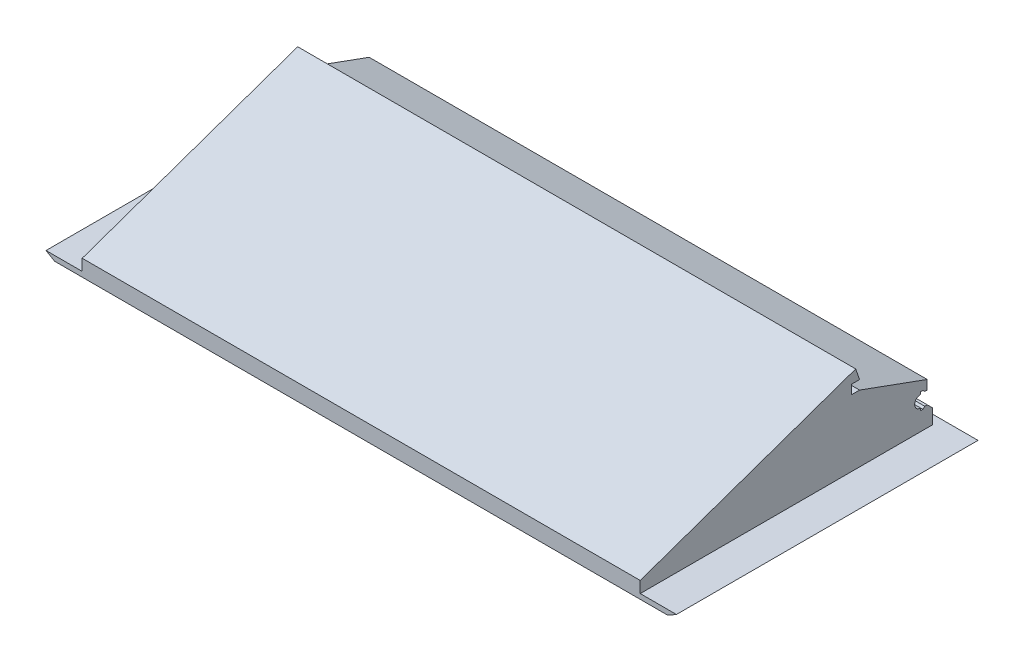
ISO-10303-21;
HEADER;
FILE_DESCRIPTION(('STEP AP214'),'2;1');
FILE_NAME('part.step','',(''),(''),'','','');
FILE_SCHEMA(('AUTOMOTIVE_DESIGN { 1 0 10303 214 1 1 1 1 }'));
ENDSEC;
DATA;
#1=APPLICATION_CONTEXT('core data for automotive mechanical design processes');
#2=APPLICATION_PROTOCOL_DEFINITION('international standard','automotive_design',2000,#1);
#3=PRODUCT_CONTEXT('',#1,'mechanical');
#4=PRODUCT('Part','Part','',(#3));
#5=PRODUCT_RELATED_PRODUCT_CATEGORY('part','',(#4));
#6=PRODUCT_DEFINITION_FORMATION('','',#4);
#7=PRODUCT_DEFINITION_CONTEXT('part definition',#1,'design');
#8=PRODUCT_DEFINITION('design','',#6,#7);
#9=PRODUCT_DEFINITION_SHAPE('','',#8);
#10=(LENGTH_UNIT() NAMED_UNIT(*) SI_UNIT(.MILLI.,.METRE.));
#11=(NAMED_UNIT(*) PLANE_ANGLE_UNIT() SI_UNIT($,.RADIAN.));
#12=(NAMED_UNIT(*) SI_UNIT($,.STERADIAN.) SOLID_ANGLE_UNIT());
#13=UNCERTAINTY_MEASURE_WITH_UNIT(LENGTH_MEASURE(1.E-05),#10,'distance_accuracy_value','');
#14=(GEOMETRIC_REPRESENTATION_CONTEXT(3) GLOBAL_UNCERTAINTY_ASSIGNED_CONTEXT((#13)) GLOBAL_UNIT_ASSIGNED_CONTEXT((#10,
#11,#12)) REPRESENTATION_CONTEXT('',''));
#15=CARTESIAN_POINT('',(0.,0.,0.));
#16=DIRECTION('',(0.,0.,1.));
#17=DIRECTION('',(1.,0.,0.));
#18=AXIS2_PLACEMENT_3D('',#15,#16,#17);
#19=CARTESIAN_POINT('',(-687.5,2.50000000000008,1257.));
#20=DIRECTION('',(1.,0.,0.));
#21=DIRECTION('',(0.,0.,1.));
#22=AXIS2_PLACEMENT_3D('',#19,#20,#21);
#23=PLANE('',#22);
#24=DIRECTION('',(0.,-1.,0.));
#25=VECTOR('',#24,1.);
#26=CARTESIAN_POINT('',(-687.5,-30.5,1872.5));
#27=LINE('',#26,#25);
#28=CARTESIAN_POINT('',(-687.5,-30.5,1872.5));
#29=VERTEX_POINT('',#28);
#30=CARTESIAN_POINT('',(-687.5,-55.5,1872.5));
#31=VERTEX_POINT('',#30);
#32=EDGE_CURVE('E267',#29,#31,#27,.T.);
#33=ORIENTED_EDGE('',*,*,#32,.F.);
#34=DIRECTION('',(0.,-0.330436486116604,0.943828230475711));
#35=VECTOR('',#34,1.);
#36=CARTESIAN_POINT('',(-687.5,135.1049797885,1399.4812457193));
#37=LINE('',#36,#35);
#38=CARTESIAN_POINT('',(-687.5,135.1049797885,1399.4812457193));
#39=VERTEX_POINT('',#38);
#40=EDGE_CURVE('E36',#39,#29,#37,.T.);
#41=ORIENTED_EDGE('',*,*,#40,.F.);
#42=DIRECTION('',(0.,0.944844352116931,0.32751969448071));
#43=VECTOR('',#42,1.);
#44=CARTESIAN_POINT('',(-687.5,110.6378797885,1391.));
#45=LINE('',#44,#43);
#46=CARTESIAN_POINT('',(-687.5,110.6378797885,1391.));
#47=VERTEX_POINT('',#46);
#48=EDGE_CURVE('E236',#47,#39,#45,.T.);
#49=ORIENTED_EDGE('',*,*,#48,.F.);
#50=DIRECTION('',(0.,0.,-1.));
#51=VECTOR('',#50,1.);
#52=CARTESIAN_POINT('',(-687.5,110.6378797885,1409.));
#53=LINE('',#52,#51);
#54=CARTESIAN_POINT('',(-687.5,110.6378797885,1409.));
#55=VERTEX_POINT('',#54);
#56=EDGE_CURVE('E237',#55,#47,#53,.T.);
#57=ORIENTED_EDGE('',*,*,#56,.F.);
#58=DIRECTION('',(0.,1.,0.));
#59=VECTOR('',#58,1.);
#60=CARTESIAN_POINT('',(-687.5,90.6378797885301,1409.));
#61=LINE('',#60,#59);
#62=CARTESIAN_POINT('',(-687.5,90.6378797885301,1409.));
#63=VERTEX_POINT('',#62);
#64=EDGE_CURVE('E183',#63,#55,#61,.T.);
#65=ORIENTED_EDGE('',*,*,#64,.F.);
#66=DIRECTION('',(0.,0.,1.));
#67=VECTOR('',#66,1.);
#68=CARTESIAN_POINT('',(-687.5,90.6378797885301,1391.));
#69=LINE('',#68,#67);
#70=CARTESIAN_POINT('',(-687.5,90.6378797885301,1391.));
#71=VERTEX_POINT('',#70);
#72=EDGE_CURVE('E181',#71,#63,#69,.T.);
#73=ORIENTED_EDGE('',*,*,#72,.F.);
#74=DIRECTION('',(0.,0.342020143325699,0.939692620785897));
#75=VECTOR('',#74,1.);
#76=CARTESIAN_POINT('',(-687.5,36.5883,1242.5));
#77=LINE('',#76,#75);
#78=CARTESIAN_POINT('',(-687.5,36.5883,1242.5));
#79=VERTEX_POINT('',#78);
#80=EDGE_CURVE('E212',#79,#71,#77,.T.);
#81=ORIENTED_EDGE('',*,*,#80,.F.);
#82=DIRECTION('',(0.,1.,0.));
#83=VECTOR('',#82,1.);
#84=CARTESIAN_POINT('',(-687.5,16.5,1242.5));
#85=LINE('',#84,#83);
#86=CARTESIAN_POINT('',(-687.5,16.5,1242.5));
#87=VERTEX_POINT('',#86);
#88=EDGE_CURVE('E213',#87,#79,#85,.T.);
#89=ORIENTED_EDGE('',*,*,#88,.F.);
#90=DIRECTION('',(0.,0.,-1.));
#91=VECTOR('',#90,1.);
#92=CARTESIAN_POINT('',(-687.5,16.5,1248.));
#93=LINE('',#92,#91);
#94=CARTESIAN_POINT('',(-687.5,16.5,1248.));
#95=VERTEX_POINT('',#94);
#96=EDGE_CURVE('E21',#95,#87,#93,.T.);
#97=ORIENTED_EDGE('',*,*,#96,.F.);
#98=DIRECTION('',(0.,-0.707106781186498,-0.707106781186597));
#99=VECTOR('',#98,1.);
#100=CARTESIAN_POINT('',(-687.5,20.5,1252.));
#101=LINE('',#100,#99);
#102=CARTESIAN_POINT('',(-687.5,20.5,1252.));
#103=VERTEX_POINT('',#102);
#104=EDGE_CURVE('E257',#103,#95,#101,.T.);
#105=ORIENTED_EDGE('',*,*,#104,.F.);
#106=DIRECTION('',(0.,0.,-1.));
#107=VECTOR('',#106,1.);
#108=CARTESIAN_POINT('',(-687.5,20.5,1257.));
#109=LINE('',#108,#107);
#110=CARTESIAN_POINT('',(-687.5,20.5,1257.));
#111=VERTEX_POINT('',#110);
#112=EDGE_CURVE('E202',#111,#103,#109,.T.);
#113=ORIENTED_EDGE('',*,*,#112,.F.);
#114=DIRECTION('',(0.,1.,0.));
#115=VECTOR('',#114,1.);
#116=CARTESIAN_POINT('',(-687.5,15.5,1257.));
#117=LINE('',#116,#115);
#118=CARTESIAN_POINT('',(-687.5,15.5,1257.));
#119=VERTEX_POINT('',#118);
#120=EDGE_CURVE('E203',#119,#111,#117,.T.);
#121=ORIENTED_EDGE('',*,*,#120,.F.);
#122=CARTESIAN_POINT('',(-687.5,2.50000000000008,1257.));
#123=DIRECTION('',(-1.,0.,0.));
#124=DIRECTION('',(0.,-1.,0.));
#125=AXIS2_PLACEMENT_3D('',#122,#123,#124);
#126=CIRCLE('',#125,13.);
#127=CARTESIAN_POINT('',(-687.5,-10.5,1257.));
#128=VERTEX_POINT('',#127);
#129=EDGE_CURVE('E337',#128,#119,#126,.T.);
#130=ORIENTED_EDGE('',*,*,#129,.F.);
#131=DIRECTION('',(0.,1.,0.));
#132=VECTOR('',#131,1.);
#133=CARTESIAN_POINT('',(-687.5,-15.5,1257.));
#134=LINE('',#133,#132);
#135=CARTESIAN_POINT('',(-687.5,-15.5,1257.));
#136=VERTEX_POINT('',#135);
#137=EDGE_CURVE('E246',#136,#128,#134,.T.);
#138=ORIENTED_EDGE('',*,*,#137,.F.);
#139=DIRECTION('',(0.,0.,1.));
#140=VECTOR('',#139,1.);
#141=CARTESIAN_POINT('',(-687.5,-15.5,1252.));
#142=LINE('',#141,#140);
#143=CARTESIAN_POINT('',(-687.5,-15.5,1252.));
#144=VERTEX_POINT('',#143);
#145=EDGE_CURVE('E207',#144,#136,#142,.T.);
#146=ORIENTED_EDGE('',*,*,#145,.F.);
#147=DIRECTION('',(0.,-0.707106781186498,0.707106781186597));
#148=VECTOR('',#147,1.);
#149=CARTESIAN_POINT('',(-687.5,-11.5,1248.));
#150=LINE('',#149,#148);
#151=CARTESIAN_POINT('',(-687.5,-11.5,1248.));
#152=VERTEX_POINT('',#151);
#153=EDGE_CURVE('E208',#152,#144,#150,.T.);
#154=ORIENTED_EDGE('',*,*,#153,.F.);
#155=DIRECTION('',(0.,0.,1.));
#156=VECTOR('',#155,1.);
#157=CARTESIAN_POINT('',(-687.5,-11.5,1242.5));
#158=LINE('',#157,#156);
#159=CARTESIAN_POINT('',(-687.5,-11.5,1242.5));
#160=VERTEX_POINT('',#159);
#161=EDGE_CURVE('E285',#160,#152,#158,.T.);
#162=ORIENTED_EDGE('',*,*,#161,.F.);
#163=DIRECTION('',(0.,0.707106781186598,0.707106781186498));
#164=VECTOR('',#163,1.);
#165=CARTESIAN_POINT('',(-687.5,-23.,1231.));
#166=LINE('',#165,#164);
#167=CARTESIAN_POINT('',(-687.5,-23.,1231.));
#168=VERTEX_POINT('',#167);
#169=EDGE_CURVE('E214',#168,#160,#166,.T.);
#170=ORIENTED_EDGE('',*,*,#169,.F.);
#171=DIRECTION('',(0.,1.,0.));
#172=VECTOR('',#171,1.);
#173=CARTESIAN_POINT('',(-687.5,-55.5,1231.));
#174=LINE('',#173,#172);
#175=CARTESIAN_POINT('',(-687.5,-55.5,1231.));
#176=VERTEX_POINT('',#175);
#177=EDGE_CURVE('E217',#176,#168,#174,.T.);
#178=ORIENTED_EDGE('',*,*,#177,.F.);
#179=DIRECTION('',(0.,0.,-1.));
#180=VECTOR('',#179,1.);
#181=CARTESIAN_POINT('',(-687.5,-55.5,1872.5));
#182=LINE('',#181,#180);
#183=EDGE_CURVE('E263',#31,#176,#182,.T.);
#184=ORIENTED_EDGE('',*,*,#183,.F.);
#185=EDGE_LOOP('',(#33,#41,#49,#57,#65,#73,#81,#89,#97,#105,#113,#121,#130,#138,#146,#154,#162,
#170,#178,#184));
#186=FACE_BOUND('',#185,.T.);
#187=ADVANCED_FACE('F17',(#186),#23,.F.);
#188=CARTESIAN_POINT('',(617.,-55.5,1872.5));
#189=DIRECTION('',(0.,1.,0.));
#190=DIRECTION('',(0.,0.,-1.));
#191=AXIS2_PLACEMENT_3D('',#188,#189,#190);
#192=PLANE('',#191);
#193=DIRECTION('',(1.,0.,0.));
#194=VECTOR('',#193,1.);
#195=CARTESIAN_POINT('',(-687.5,-55.5,1231.));
#196=LINE('',#195,#194);
#197=CARTESIAN_POINT('',(537.5,-55.5,1231.));
#198=VERTEX_POINT('',#197);
#199=EDGE_CURVE('E11',#176,#198,#196,.T.);
#200=ORIENTED_EDGE('',*,*,#199,.T.);
#201=DIRECTION('',(0.,0.,-1.));
#202=VECTOR('',#201,1.);
#203=CARTESIAN_POINT('',(537.5,-55.5,1872.5));
#204=LINE('',#203,#202);
#205=CARTESIAN_POINT('',(537.5,-55.5,1872.5));
#206=VERTEX_POINT('',#205);
#207=EDGE_CURVE('E299',#206,#198,#204,.T.);
#208=ORIENTED_EDGE('',*,*,#207,.F.);
#209=DIRECTION('',(-1.,0.,0.));
#210=VECTOR('',#209,1.);
#211=CARTESIAN_POINT('',(617.,-55.5,1872.5));
#212=LINE('',#211,#210);
#213=CARTESIAN_POINT('',(617.,-55.5,1872.5));
#214=VERTEX_POINT('',#213);
#215=EDGE_CURVE('E232',#214,#206,#212,.T.);
#216=ORIENTED_EDGE('',*,*,#215,.F.);
#217=DIRECTION('',(0.,0.,-1.));
#218=VECTOR('',#217,1.);
#219=CARTESIAN_POINT('',(617.,-55.5,1872.5));
#220=LINE('',#219,#218);
#221=CARTESIAN_POINT('',(617.,-55.5,1210.5));
#222=VERTEX_POINT('',#221);
#223=EDGE_CURVE('E27',#214,#222,#220,.T.);
#224=ORIENTED_EDGE('',*,*,#223,.T.);
#225=DIRECTION('',(-1.,0.,0.));
#226=VECTOR('',#225,1.);
#227=CARTESIAN_POINT('',(617.,-55.5,1210.5));
#228=LINE('',#227,#226);
#229=CARTESIAN_POINT('',(-767.,-55.5,1210.5));
#230=VERTEX_POINT('',#229);
#231=EDGE_CURVE('E266',#222,#230,#228,.T.);
#232=ORIENTED_EDGE('',*,*,#231,.T.);
#233=DIRECTION('',(0.,0.,-1.));
#234=VECTOR('',#233,1.);
#235=CARTESIAN_POINT('',(-767.,-55.5,1872.5));
#236=LINE('',#235,#234);
#237=CARTESIAN_POINT('',(-767.,-55.5,1872.5));
#238=VERTEX_POINT('',#237);
#239=EDGE_CURVE('E295',#238,#230,#236,.T.);
#240=ORIENTED_EDGE('',*,*,#239,.F.);
#241=DIRECTION('',(-1.,0.,0.));
#242=VECTOR('',#241,1.);
#243=CARTESIAN_POINT('',(-687.5,-55.5,1872.5));
#244=LINE('',#243,#242);
#245=EDGE_CURVE('E277',#31,#238,#244,.T.);
#246=ORIENTED_EDGE('',*,*,#245,.F.);
#247=ORIENTED_EDGE('',*,*,#183,.T.);
#248=EDGE_LOOP('',(#200,#208,#216,#224,#232,#240,#246,#247));
#249=FACE_BOUND('',#248,.T.);
#250=ADVANCED_FACE('F19',(#249),#192,.T.);
#251=CARTESIAN_POINT('',(-687.5,-30.5,1872.5));
#252=DIRECTION('',(0.,0.,1.));
#253=DIRECTION('',(1.,0.,0.));
#254=AXIS2_PLACEMENT_3D('',#251,#252,#253);
#255=PLANE('',#254);
#256=DIRECTION('',(1.,0.,0.));
#257=VECTOR('',#256,1.);
#258=CARTESIAN_POINT('',(-687.5,-30.5,1872.5));
#259=LINE('',#258,#257);
#260=CARTESIAN_POINT('',(537.5,-30.5,1872.5));
#261=VERTEX_POINT('',#260);
#262=EDGE_CURVE('E192',#29,#261,#259,.T.);
#263=ORIENTED_EDGE('',*,*,#262,.F.);
#264=ORIENTED_EDGE('',*,*,#32,.T.);
#265=ORIENTED_EDGE('',*,*,#245,.T.);
#266=DIRECTION('',(0.866025403784429,-0.500000000000017,0.));
#267=VECTOR('',#266,1.);
#268=CARTESIAN_POINT('',(-767.,-55.5,1872.5));
#269=LINE('',#268,#267);
#270=CARTESIAN_POINT('',(-747.9474411167,-66.5,1872.5));
#271=VERTEX_POINT('',#270);
#272=EDGE_CURVE('E223',#238,#271,#269,.T.);
#273=ORIENTED_EDGE('',*,*,#272,.T.);
#274=DIRECTION('',(1.,0.,0.));
#275=VECTOR('',#274,1.);
#276=CARTESIAN_POINT('',(-747.9474411167,-66.5,1872.5));
#277=LINE('',#276,#275);
#278=CARTESIAN_POINT('',(597.9474411167,-66.5,1872.5));
#279=VERTEX_POINT('',#278);
#280=EDGE_CURVE('E220',#271,#279,#277,.T.);
#281=ORIENTED_EDGE('',*,*,#280,.T.);
#282=DIRECTION('',(0.866025403784429,0.500000000000017,0.));
#283=VECTOR('',#282,1.);
#284=CARTESIAN_POINT('',(597.9474411167,-66.5,1872.5));
#285=LINE('',#284,#283);
#286=EDGE_CURVE('E224',#279,#214,#285,.T.);
#287=ORIENTED_EDGE('',*,*,#286,.T.);
#288=ORIENTED_EDGE('',*,*,#215,.T.);
#289=DIRECTION('',(0.,-1.,0.));
#290=VECTOR('',#289,1.);
#291=CARTESIAN_POINT('',(537.5,-30.5,1872.5));
#292=LINE('',#291,#290);
#293=EDGE_CURVE('E301',#261,#206,#292,.T.);
#294=ORIENTED_EDGE('',*,*,#293,.F.);
#295=EDGE_LOOP('',(#263,#264,#265,#273,#281,#287,#288,#294));
#296=FACE_BOUND('',#295,.T.);
#297=ADVANCED_FACE('F401',(#296),#255,.T.);
#298=CARTESIAN_POINT('',(537.5,2.50000000000008,1257.));
#299=DIRECTION('',(1.,0.,0.));
#300=DIRECTION('',(0.,0.,1.));
#301=AXIS2_PLACEMENT_3D('',#298,#299,#300);
#302=PLANE('',#301);
#303=DIRECTION('',(0.,1.,0.));
#304=VECTOR('',#303,1.);
#305=CARTESIAN_POINT('',(537.5,-55.5,1231.));
#306=LINE('',#305,#304);
#307=CARTESIAN_POINT('',(537.5,-23.,1231.));
#308=VERTEX_POINT('',#307);
#309=EDGE_CURVE('E240',#198,#308,#306,.T.);
#310=ORIENTED_EDGE('',*,*,#309,.T.);
#311=DIRECTION('',(0.,0.707106781186598,0.707106781186498));
#312=VECTOR('',#311,1.);
#313=CARTESIAN_POINT('',(537.5,-23.,1231.));
#314=LINE('',#313,#312);
#315=CARTESIAN_POINT('',(537.5,-11.5,1242.5));
#316=VERTEX_POINT('',#315);
#317=EDGE_CURVE('E197',#308,#316,#314,.T.);
#318=ORIENTED_EDGE('',*,*,#317,.T.);
#319=DIRECTION('',(0.,0.,1.));
#320=VECTOR('',#319,1.);
#321=CARTESIAN_POINT('',(537.5,-11.5,1242.5));
#322=LINE('',#321,#320);
#323=CARTESIAN_POINT('',(537.5,-11.5,1248.));
#324=VERTEX_POINT('',#323);
#325=EDGE_CURVE('E194',#316,#324,#322,.T.);
#326=ORIENTED_EDGE('',*,*,#325,.T.);
#327=DIRECTION('',(0.,-0.707106781186498,0.707106781186597));
#328=VECTOR('',#327,1.);
#329=CARTESIAN_POINT('',(537.5,-11.5,1248.));
#330=LINE('',#329,#328);
#331=CARTESIAN_POINT('',(537.5,-15.5,1252.));
#332=VERTEX_POINT('',#331);
#333=EDGE_CURVE('E198',#324,#332,#330,.T.);
#334=ORIENTED_EDGE('',*,*,#333,.T.);
#335=DIRECTION('',(0.,0.,1.));
#336=VECTOR('',#335,1.);
#337=CARTESIAN_POINT('',(537.5,-15.5,1252.));
#338=LINE('',#337,#336);
#339=CARTESIAN_POINT('',(537.5,-15.5,1257.));
#340=VERTEX_POINT('',#339);
#341=EDGE_CURVE('E298',#332,#340,#338,.T.);
#342=ORIENTED_EDGE('',*,*,#341,.T.);
#343=DIRECTION('',(0.,1.,0.));
#344=VECTOR('',#343,1.);
#345=CARTESIAN_POINT('',(537.5,-15.5,1257.));
#346=LINE('',#345,#344);
#347=CARTESIAN_POINT('',(537.5,-10.5,1257.));
#348=VERTEX_POINT('',#347);
#349=EDGE_CURVE('E316',#340,#348,#346,.T.);
#350=ORIENTED_EDGE('',*,*,#349,.T.);
#351=CARTESIAN_POINT('',(537.5,2.50000000000008,1257.));
#352=DIRECTION('',(-1.,0.,0.));
#353=DIRECTION('',(0.,-1.,0.));
#354=AXIS2_PLACEMENT_3D('',#351,#352,#353);
#355=CIRCLE('',#354,13.);
#356=CARTESIAN_POINT('',(537.5,15.5,1257.));
#357=VERTEX_POINT('',#356);
#358=EDGE_CURVE('E252',#348,#357,#355,.T.);
#359=ORIENTED_EDGE('',*,*,#358,.T.);
#360=DIRECTION('',(0.,1.,0.));
#361=VECTOR('',#360,1.);
#362=CARTESIAN_POINT('',(537.5,15.5,1257.));
#363=LINE('',#362,#361);
#364=CARTESIAN_POINT('',(537.5,20.5,1257.));
#365=VERTEX_POINT('',#364);
#366=EDGE_CURVE('E249',#357,#365,#363,.T.);
#367=ORIENTED_EDGE('',*,*,#366,.T.);
#368=DIRECTION('',(0.,0.,-1.));
#369=VECTOR('',#368,1.);
#370=CARTESIAN_POINT('',(537.5,20.5,1257.));
#371=LINE('',#370,#369);
#372=CARTESIAN_POINT('',(537.5,20.5,1252.));
#373=VERTEX_POINT('',#372);
#374=EDGE_CURVE('E253',#365,#373,#371,.T.);
#375=ORIENTED_EDGE('',*,*,#374,.T.);
#376=DIRECTION('',(0.,-0.707106781186498,-0.707106781186597));
#377=VECTOR('',#376,1.);
#378=CARTESIAN_POINT('',(537.5,20.5,1252.));
#379=LINE('',#378,#377);
#380=CARTESIAN_POINT('',(537.5,16.5,1248.));
#381=VERTEX_POINT('',#380);
#382=EDGE_CURVE('E280',#373,#381,#379,.T.);
#383=ORIENTED_EDGE('',*,*,#382,.T.);
#384=DIRECTION('',(0.,0.,-1.));
#385=VECTOR('',#384,1.);
#386=CARTESIAN_POINT('',(537.5,16.5,1248.));
#387=LINE('',#386,#385);
#388=CARTESIAN_POINT('',(537.5,16.5,1242.5));
#389=VERTEX_POINT('',#388);
#390=EDGE_CURVE('E248',#381,#389,#387,.T.);
#391=ORIENTED_EDGE('',*,*,#390,.T.);
#392=DIRECTION('',(0.,1.,0.));
#393=VECTOR('',#392,1.);
#394=CARTESIAN_POINT('',(537.5,16.5,1242.5));
#395=LINE('',#394,#393);
#396=CARTESIAN_POINT('',(537.5,36.5883,1242.5));
#397=VERTEX_POINT('',#396);
#398=EDGE_CURVE('E219',#389,#397,#395,.T.);
#399=ORIENTED_EDGE('',*,*,#398,.T.);
#400=DIRECTION('',(0.,0.342020143325699,0.939692620785897));
#401=VECTOR('',#400,1.);
#402=CARTESIAN_POINT('',(537.5,36.5883,1242.5));
#403=LINE('',#402,#401);
#404=CARTESIAN_POINT('',(537.5,90.6378797885301,1391.));
#405=VERTEX_POINT('',#404);
#406=EDGE_CURVE('E174',#397,#405,#403,.T.);
#407=ORIENTED_EDGE('',*,*,#406,.T.);
#408=DIRECTION('',(0.,0.,1.));
#409=VECTOR('',#408,1.);
#410=CARTESIAN_POINT('',(537.5,90.6378797885301,1391.));
#411=LINE('',#410,#409);
#412=CARTESIAN_POINT('',(537.5,90.6378797885301,1409.));
#413=VERTEX_POINT('',#412);
#414=EDGE_CURVE('E167',#405,#413,#411,.T.);
#415=ORIENTED_EDGE('',*,*,#414,.T.);
#416=DIRECTION('',(0.,1.,0.));
#417=VECTOR('',#416,1.);
#418=CARTESIAN_POINT('',(537.5,90.6378797885301,1409.));
#419=LINE('',#418,#417);
#420=CARTESIAN_POINT('',(537.5,110.6378797885,1409.));
#421=VERTEX_POINT('',#420);
#422=EDGE_CURVE('E157',#413,#421,#419,.T.);
#423=ORIENTED_EDGE('',*,*,#422,.T.);
#424=DIRECTION('',(0.,0.,-1.));
#425=VECTOR('',#424,1.);
#426=CARTESIAN_POINT('',(537.5,110.6378797885,1409.));
#427=LINE('',#426,#425);
#428=CARTESIAN_POINT('',(537.5,110.6378797885,1391.));
#429=VERTEX_POINT('',#428);
#430=EDGE_CURVE('E168',#421,#429,#427,.T.);
#431=ORIENTED_EDGE('',*,*,#430,.T.);
#432=DIRECTION('',(0.,0.944844352116931,0.32751969448071));
#433=VECTOR('',#432,1.);
#434=CARTESIAN_POINT('',(537.5,110.6378797885,1391.));
#435=LINE('',#434,#433);
#436=CARTESIAN_POINT('',(537.5,135.1049797885,1399.4812457193));
#437=VERTEX_POINT('',#436);
#438=EDGE_CURVE('E274',#429,#437,#435,.T.);
#439=ORIENTED_EDGE('',*,*,#438,.T.);
#440=DIRECTION('',(0.,-0.330436486116604,0.943828230475711));
#441=VECTOR('',#440,1.);
#442=CARTESIAN_POINT('',(537.5,135.1049797885,1399.4812457193));
#443=LINE('',#442,#441);
#444=EDGE_CURVE('E309',#437,#261,#443,.T.);
#445=ORIENTED_EDGE('',*,*,#444,.T.);
#446=ORIENTED_EDGE('',*,*,#293,.T.);
#447=ORIENTED_EDGE('',*,*,#207,.T.);
#448=EDGE_LOOP('',(#310,#318,#326,#334,#342,#350,#359,#367,#375,#383,#391,#399,#407,#415,#423,
#431,#439,#445,#446,#447));
#449=FACE_BOUND('',#448,.T.);
#450=ADVANCED_FACE('F172',(#449),#302,.T.);
#451=CARTESIAN_POINT('',(-687.5,135.1049797885,1399.4812457193));
#452=DIRECTION('',(0.,0.943828230475711,0.330436486116604));
#453=DIRECTION('',(-1.,0.,0.));
#454=AXIS2_PLACEMENT_3D('',#451,#452,#453);
#455=PLANE('',#454);
#456=ORIENTED_EDGE('',*,*,#262,.T.);
#457=ORIENTED_EDGE('',*,*,#444,.F.);
#458=DIRECTION('',(1.,0.,0.));
#459=VECTOR('',#458,1.);
#460=CARTESIAN_POINT('',(-687.5,135.1049797885,1399.4812457193));
#461=LINE('',#460,#459);
#462=EDGE_CURVE('E193',#39,#437,#461,.T.);
#463=ORIENTED_EDGE('',*,*,#462,.F.);
#464=ORIENTED_EDGE('',*,*,#40,.T.);
#465=EDGE_LOOP('',(#456,#457,#463,#464));
#466=FACE_BOUND('',#465,.T.);
#467=ADVANCED_FACE('F420',(#466),#455,.T.);
#468=CARTESIAN_POINT('',(-687.5,110.6378797885,1391.));
#469=DIRECTION('',(0.,0.32751969448071,-0.94484435211693));
#470=DIRECTION('',(0.,0.94484435211693,0.32751969448071));
#471=AXIS2_PLACEMENT_3D('',#468,#469,#470);
#472=PLANE('',#471);
#473=ORIENTED_EDGE('',*,*,#462,.T.);
#474=ORIENTED_EDGE('',*,*,#438,.F.);
#475=DIRECTION('',(1.,0.,0.));
#476=VECTOR('',#475,1.);
#477=CARTESIAN_POINT('',(-687.5,110.6378797885,1391.));
#478=LINE('',#477,#476);
#479=EDGE_CURVE('E233',#47,#429,#478,.T.);
#480=ORIENTED_EDGE('',*,*,#479,.F.);
#481=ORIENTED_EDGE('',*,*,#48,.T.);
#482=EDGE_LOOP('',(#473,#474,#480,#481));
#483=FACE_BOUND('',#482,.T.);
#484=ADVANCED_FACE('F422',(#483),#472,.T.);
#485=CARTESIAN_POINT('',(-687.5,110.6378797885,1409.));
#486=DIRECTION('',(0.,-1.,0.));
#487=DIRECTION('',(1.,0.,0.));
#488=AXIS2_PLACEMENT_3D('',#485,#486,#487);
#489=PLANE('',#488);
#490=ORIENTED_EDGE('',*,*,#479,.T.);
#491=ORIENTED_EDGE('',*,*,#430,.F.);
#492=DIRECTION('',(1.,0.,0.));
#493=VECTOR('',#492,1.);
#494=CARTESIAN_POINT('',(-687.5,110.6378797885,1409.));
#495=LINE('',#494,#493);
#496=EDGE_CURVE('E164',#55,#421,#495,.T.);
#497=ORIENTED_EDGE('',*,*,#496,.F.);
#498=ORIENTED_EDGE('',*,*,#56,.T.);
#499=EDGE_LOOP('',(#490,#491,#497,#498));
#500=FACE_BOUND('',#499,.T.);
#501=ADVANCED_FACE('F427',(#500),#489,.T.);
#502=CARTESIAN_POINT('',(-687.5,90.6378797885301,1409.));
#503=DIRECTION('',(0.,0.,-1.));
#504=DIRECTION('',(0.,1.,0.));
#505=AXIS2_PLACEMENT_3D('',#502,#503,#504);
#506=PLANE('',#505);
#507=ORIENTED_EDGE('',*,*,#496,.T.);
#508=ORIENTED_EDGE('',*,*,#422,.F.);
#509=DIRECTION('',(1.,0.,0.));
#510=VECTOR('',#509,1.);
#511=CARTESIAN_POINT('',(-687.5,90.6378797885301,1409.));
#512=LINE('',#511,#510);
#513=EDGE_CURVE('E162',#63,#413,#512,.T.);
#514=ORIENTED_EDGE('',*,*,#513,.F.);
#515=ORIENTED_EDGE('',*,*,#64,.T.);
#516=EDGE_LOOP('',(#507,#508,#514,#515));
#517=FACE_BOUND('',#516,.T.);
#518=ADVANCED_FACE('F159',(#517),#506,.T.);
#519=CARTESIAN_POINT('',(-687.5,90.6378797885301,1391.));
#520=DIRECTION('',(0.,1.,0.));
#521=DIRECTION('',(0.,0.,-1.));
#522=AXIS2_PLACEMENT_3D('',#519,#520,#521);
#523=PLANE('',#522);
#524=ORIENTED_EDGE('',*,*,#513,.T.);
#525=ORIENTED_EDGE('',*,*,#414,.F.);
#526=DIRECTION('',(1.,0.,0.));
#527=VECTOR('',#526,1.);
#528=CARTESIAN_POINT('',(-687.5,90.6378797885301,1391.));
#529=LINE('',#528,#527);
#530=EDGE_CURVE('E186',#71,#405,#529,.T.);
#531=ORIENTED_EDGE('',*,*,#530,.F.);
#532=ORIENTED_EDGE('',*,*,#72,.T.);
#533=EDGE_LOOP('',(#524,#525,#531,#532));
#534=FACE_BOUND('',#533,.T.);
#535=ADVANCED_FACE('F179',(#534),#523,.T.);
#536=CARTESIAN_POINT('',(-687.5,36.5883,1242.5));
#537=DIRECTION('',(0.,0.939692620785897,-0.342020143325699));
#538=DIRECTION('',(0.,-0.342020143325699,-0.939692620785897));
#539=AXIS2_PLACEMENT_3D('',#536,#537,#538);
#540=PLANE('',#539);
#541=ORIENTED_EDGE('',*,*,#530,.T.);
#542=ORIENTED_EDGE('',*,*,#406,.F.);
#543=DIRECTION('',(1.,0.,0.));
#544=VECTOR('',#543,1.);
#545=CARTESIAN_POINT('',(-687.5,36.5883,1242.5));
#546=LINE('',#545,#544);
#547=EDGE_CURVE('E209',#79,#397,#546,.T.);
#548=ORIENTED_EDGE('',*,*,#547,.F.);
#549=ORIENTED_EDGE('',*,*,#80,.T.);
#550=EDGE_LOOP('',(#541,#542,#548,#549));
#551=FACE_BOUND('',#550,.T.);
#552=ADVANCED_FACE('F456',(#551),#540,.T.);
#553=CARTESIAN_POINT('',(-687.5,16.5,1242.5));
#554=DIRECTION('',(0.,0.,-1.));
#555=DIRECTION('',(0.,1.,0.));
#556=AXIS2_PLACEMENT_3D('',#553,#554,#555);
#557=PLANE('',#556);
#558=ORIENTED_EDGE('',*,*,#547,.T.);
#559=ORIENTED_EDGE('',*,*,#398,.F.);
#560=DIRECTION('',(1.,0.,0.));
#561=VECTOR('',#560,1.);
#562=CARTESIAN_POINT('',(-687.5,16.5,1242.5));
#563=LINE('',#562,#561);
#564=EDGE_CURVE('E260',#87,#389,#563,.T.);
#565=ORIENTED_EDGE('',*,*,#564,.F.);
#566=ORIENTED_EDGE('',*,*,#88,.T.);
#567=EDGE_LOOP('',(#558,#559,#565,#566));
#568=FACE_BOUND('',#567,.T.);
#569=ADVANCED_FACE('F460',(#568),#557,.T.);
#570=CARTESIAN_POINT('',(-687.5,16.5,1248.));
#571=DIRECTION('',(0.,-1.,0.));
#572=DIRECTION('',(1.,0.,0.));
#573=AXIS2_PLACEMENT_3D('',#570,#571,#572);
#574=PLANE('',#573);
#575=ORIENTED_EDGE('',*,*,#564,.T.);
#576=ORIENTED_EDGE('',*,*,#390,.F.);
#577=DIRECTION('',(1.,0.,0.));
#578=VECTOR('',#577,1.);
#579=CARTESIAN_POINT('',(-687.5,16.5,1248.));
#580=LINE('',#579,#578);
#581=EDGE_CURVE('E254',#95,#381,#580,.T.);
#582=ORIENTED_EDGE('',*,*,#581,.F.);
#583=ORIENTED_EDGE('',*,*,#96,.T.);
#584=EDGE_LOOP('',(#575,#576,#582,#583));
#585=FACE_BOUND('',#584,.T.);
#586=ADVANCED_FACE('F466',(#585),#574,.T.);
#587=CARTESIAN_POINT('',(-687.5,20.5,1252.));
#588=DIRECTION('',(0.,-0.707106781186598,0.707106781186498));
#589=DIRECTION('',(1.,0.,0.));
#590=AXIS2_PLACEMENT_3D('',#587,#588,#589);
#591=PLANE('',#590);
#592=ORIENTED_EDGE('',*,*,#581,.T.);
#593=ORIENTED_EDGE('',*,*,#382,.F.);
#594=DIRECTION('',(1.,0.,0.));
#595=VECTOR('',#594,1.);
#596=CARTESIAN_POINT('',(-687.5,20.5,1252.));
#597=LINE('',#596,#595);
#598=EDGE_CURVE('E270',#103,#373,#597,.T.);
#599=ORIENTED_EDGE('',*,*,#598,.F.);
#600=ORIENTED_EDGE('',*,*,#104,.T.);
#601=EDGE_LOOP('',(#592,#593,#599,#600));
#602=FACE_BOUND('',#601,.T.);
#603=ADVANCED_FACE('F477',(#602),#591,.T.);
#604=CARTESIAN_POINT('',(-687.5,20.5,1257.));
#605=DIRECTION('',(0.,-1.,0.));
#606=DIRECTION('',(1.,0.,0.));
#607=AXIS2_PLACEMENT_3D('',#604,#605,#606);
#608=PLANE('',#607);
#609=ORIENTED_EDGE('',*,*,#598,.T.);
#610=ORIENTED_EDGE('',*,*,#374,.F.);
#611=DIRECTION('',(1.,0.,0.));
#612=VECTOR('',#611,1.);
#613=CARTESIAN_POINT('',(-687.5,20.5,1257.));
#614=LINE('',#613,#612);
#615=EDGE_CURVE('E199',#111,#365,#614,.T.);
#616=ORIENTED_EDGE('',*,*,#615,.F.);
#617=ORIENTED_EDGE('',*,*,#112,.T.);
#618=EDGE_LOOP('',(#609,#610,#616,#617));
#619=FACE_BOUND('',#618,.T.);
#620=ADVANCED_FACE('F474',(#619),#608,.T.);
#621=CARTESIAN_POINT('',(-687.5,15.5,1257.));
#622=DIRECTION('',(0.,0.,-1.));
#623=DIRECTION('',(0.,1.,0.));
#624=AXIS2_PLACEMENT_3D('',#621,#622,#623);
#625=PLANE('',#624);
#626=ORIENTED_EDGE('',*,*,#615,.T.);
#627=ORIENTED_EDGE('',*,*,#366,.F.);
#628=DIRECTION('',(1.,0.,0.));
#629=VECTOR('',#628,1.);
#630=CARTESIAN_POINT('',(-687.5,15.5,1257.));
#631=LINE('',#630,#629);
#632=EDGE_CURVE('E334',#119,#357,#631,.T.);
#633=ORIENTED_EDGE('',*,*,#632,.F.);
#634=ORIENTED_EDGE('',*,*,#120,.T.);
#635=EDGE_LOOP('',(#626,#627,#633,#634));
#636=FACE_BOUND('',#635,.T.);
#637=ADVANCED_FACE('F366',(#636),#625,.T.);
#638=CARTESIAN_POINT('',(-687.5,2.50000000000008,1257.));
#639=DIRECTION('',(1.,0.,0.));
#640=DIRECTION('',(0.,0.,-1.));
#641=AXIS2_PLACEMENT_3D('',#638,#639,#640);
#642=CYLINDRICAL_SURFACE('',#641,13.);
#643=ORIENTED_EDGE('',*,*,#632,.T.);
#644=ORIENTED_EDGE('',*,*,#358,.F.);
#645=DIRECTION('',(1.,0.,0.));
#646=VECTOR('',#645,1.);
#647=CARTESIAN_POINT('',(-687.5,-10.5,1257.));
#648=LINE('',#647,#646);
#649=EDGE_CURVE('E262',#128,#348,#648,.T.);
#650=ORIENTED_EDGE('',*,*,#649,.F.);
#651=ORIENTED_EDGE('',*,*,#129,.T.);
#652=EDGE_LOOP('',(#643,#644,#650,#651));
#653=FACE_BOUND('',#652,.T.);
#654=ADVANCED_FACE('F356',(#653),#642,.F.);
#655=CARTESIAN_POINT('',(-687.5,-15.5,1257.));
#656=DIRECTION('',(0.,0.,-1.));
#657=DIRECTION('',(0.,1.,0.));
#658=AXIS2_PLACEMENT_3D('',#655,#656,#657);
#659=PLANE('',#658);
#660=ORIENTED_EDGE('',*,*,#649,.T.);
#661=ORIENTED_EDGE('',*,*,#349,.F.);
#662=DIRECTION('',(1.,0.,0.));
#663=VECTOR('',#662,1.);
#664=CARTESIAN_POINT('',(-687.5,-15.5,1257.));
#665=LINE('',#664,#663);
#666=EDGE_CURVE('E243',#136,#340,#665,.T.);
#667=ORIENTED_EDGE('',*,*,#666,.F.);
#668=ORIENTED_EDGE('',*,*,#137,.T.);
#669=EDGE_LOOP('',(#660,#661,#667,#668));
#670=FACE_BOUND('',#669,.T.);
#671=ADVANCED_FACE('F449',(#670),#659,.T.);
#672=CARTESIAN_POINT('',(-687.5,-15.5,1252.));
#673=DIRECTION('',(0.,1.,0.));
#674=DIRECTION('',(0.,0.,-1.));
#675=AXIS2_PLACEMENT_3D('',#672,#673,#674);
#676=PLANE('',#675);
#677=ORIENTED_EDGE('',*,*,#666,.T.);
#678=ORIENTED_EDGE('',*,*,#341,.F.);
#679=DIRECTION('',(1.,0.,0.));
#680=VECTOR('',#679,1.);
#681=CARTESIAN_POINT('',(-687.5,-15.5,1252.));
#682=LINE('',#681,#680);
#683=EDGE_CURVE('E204',#144,#332,#682,.T.);
#684=ORIENTED_EDGE('',*,*,#683,.F.);
#685=ORIENTED_EDGE('',*,*,#145,.T.);
#686=EDGE_LOOP('',(#677,#678,#684,#685));
#687=FACE_BOUND('',#686,.T.);
#688=ADVANCED_FACE('F481',(#687),#676,.T.);
#689=CARTESIAN_POINT('',(-687.5,-11.5,1248.));
#690=DIRECTION('',(0.,0.707106781186598,0.707106781186498));
#691=DIRECTION('',(-1.,0.,0.));
#692=AXIS2_PLACEMENT_3D('',#689,#690,#691);
#693=PLANE('',#692);
#694=ORIENTED_EDGE('',*,*,#683,.T.);
#695=ORIENTED_EDGE('',*,*,#333,.F.);
#696=DIRECTION('',(1.,0.,0.));
#697=VECTOR('',#696,1.);
#698=CARTESIAN_POINT('',(-687.5,-11.5,1248.));
#699=LINE('',#698,#697);
#700=EDGE_CURVE('E282',#152,#324,#699,.T.);
#701=ORIENTED_EDGE('',*,*,#700,.F.);
#702=ORIENTED_EDGE('',*,*,#153,.T.);
#703=EDGE_LOOP('',(#694,#695,#701,#702));
#704=FACE_BOUND('',#703,.T.);
#705=ADVANCED_FACE('F382',(#704),#693,.T.);
#706=CARTESIAN_POINT('',(-687.5,-11.5,1242.5));
#707=DIRECTION('',(0.,1.,0.));
#708=DIRECTION('',(0.,0.,-1.));
#709=AXIS2_PLACEMENT_3D('',#706,#707,#708);
#710=PLANE('',#709);
#711=ORIENTED_EDGE('',*,*,#700,.T.);
#712=ORIENTED_EDGE('',*,*,#325,.F.);
#713=DIRECTION('',(1.,0.,0.));
#714=VECTOR('',#713,1.);
#715=CARTESIAN_POINT('',(-687.5,-11.5,1242.5));
#716=LINE('',#715,#714);
#717=EDGE_CURVE('E216',#160,#316,#716,.T.);
#718=ORIENTED_EDGE('',*,*,#717,.F.);
#719=ORIENTED_EDGE('',*,*,#161,.T.);
#720=EDGE_LOOP('',(#711,#712,#718,#719));
#721=FACE_BOUND('',#720,.T.);
#722=ADVANCED_FACE('F375',(#721),#710,.T.);
#723=CARTESIAN_POINT('',(-687.5,-23.,1231.));
#724=DIRECTION('',(0.,0.707106781186498,-0.707106781186598));
#725=DIRECTION('',(0.,0.707106781186598,0.707106781186498));
#726=AXIS2_PLACEMENT_3D('',#723,#724,#725);
#727=PLANE('',#726);
#728=ORIENTED_EDGE('',*,*,#717,.T.);
#729=ORIENTED_EDGE('',*,*,#317,.F.);
#730=DIRECTION('',(1.,0.,0.));
#731=VECTOR('',#730,1.);
#732=CARTESIAN_POINT('',(-687.5,-23.,1231.));
#733=LINE('',#732,#731);
#734=EDGE_CURVE('E225',#168,#308,#733,.T.);
#735=ORIENTED_EDGE('',*,*,#734,.F.);
#736=ORIENTED_EDGE('',*,*,#169,.T.);
#737=EDGE_LOOP('',(#728,#729,#735,#736));
#738=FACE_BOUND('',#737,.T.);
#739=ADVANCED_FACE('F452',(#738),#727,.T.);
#740=CARTESIAN_POINT('',(-687.5,-55.5,1231.));
#741=DIRECTION('',(0.,0.,-1.));
#742=DIRECTION('',(0.,1.,0.));
#743=AXIS2_PLACEMENT_3D('',#740,#741,#742);
#744=PLANE('',#743);
#745=ORIENTED_EDGE('',*,*,#177,.T.);
#746=ORIENTED_EDGE('',*,*,#734,.T.);
#747=ORIENTED_EDGE('',*,*,#309,.F.);
#748=ORIENTED_EDGE('',*,*,#199,.F.);
#749=EDGE_LOOP('',(#745,#746,#747,#748));
#750=FACE_BOUND('',#749,.T.);
#751=ADVANCED_FACE('F418',(#750),#744,.T.);
#752=CARTESIAN_POINT('',(597.9474411167,-66.5,1872.5));
#753=DIRECTION('',(0.500000000000017,-0.866025403784429,0.));
#754=DIRECTION('',(0.,0.,-1.));
#755=AXIS2_PLACEMENT_3D('',#752,#753,#754);
#756=PLANE('',#755);
#757=DIRECTION('',(0.,0.,-1.));
#758=VECTOR('',#757,1.);
#759=CARTESIAN_POINT('',(597.9474411167,-66.5,1872.5));
#760=LINE('',#759,#758);
#761=CARTESIAN_POINT('',(597.9474411167,-66.5,1210.5));
#762=VERTEX_POINT('',#761);
#763=EDGE_CURVE('E227',#279,#762,#760,.T.);
#764=ORIENTED_EDGE('',*,*,#763,.T.);
#765=DIRECTION('',(0.866025403784429,0.500000000000017,0.));
#766=VECTOR('',#765,1.);
#767=CARTESIAN_POINT('',(597.9474411167,-66.5,1210.5));
#768=LINE('',#767,#766);
#769=EDGE_CURVE('E292',#762,#222,#768,.T.);
#770=ORIENTED_EDGE('',*,*,#769,.T.);
#771=ORIENTED_EDGE('',*,*,#223,.F.);
#772=ORIENTED_EDGE('',*,*,#286,.F.);
#773=EDGE_LOOP('',(#764,#770,#771,#772));
#774=FACE_BOUND('',#773,.T.);
#775=ADVANCED_FACE('F399',(#774),#756,.T.);
#776=CARTESIAN_POINT('',(-687.5,2.50000000000008,1210.5));
#777=DIRECTION('',(0.,0.,1.));
#778=DIRECTION('',(1.,0.,0.));
#779=AXIS2_PLACEMENT_3D('',#776,#777,#778);
#780=PLANE('',#779);
#781=ORIENTED_EDGE('',*,*,#769,.F.);
#782=DIRECTION('',(1.,0.,0.));
#783=VECTOR('',#782,1.);
#784=CARTESIAN_POINT('',(-747.9474411167,-66.5,1210.5));
#785=LINE('',#784,#783);
#786=CARTESIAN_POINT('',(-747.9474411167,-66.5,1210.5));
#787=VERTEX_POINT('',#786);
#788=EDGE_CURVE('E303',#787,#762,#785,.T.);
#789=ORIENTED_EDGE('',*,*,#788,.F.);
#790=DIRECTION('',(0.866025403784429,-0.500000000000017,0.));
#791=VECTOR('',#790,1.);
#792=CARTESIAN_POINT('',(-767.,-55.5,1210.5));
#793=LINE('',#792,#791);
#794=EDGE_CURVE('E324',#230,#787,#793,.T.);
#795=ORIENTED_EDGE('',*,*,#794,.F.);
#796=ORIENTED_EDGE('',*,*,#231,.F.);
#797=EDGE_LOOP('',(#781,#789,#795,#796));
#798=FACE_BOUND('',#797,.T.);
#799=ADVANCED_FACE('F409',(#798),#780,.F.);
#800=CARTESIAN_POINT('',(-767.,-55.5,1872.5));
#801=DIRECTION('',(-0.500000000000017,-0.866025403784429,0.));
#802=DIRECTION('',(0.,0.,1.));
#803=AXIS2_PLACEMENT_3D('',#800,#801,#802);
#804=PLANE('',#803);
#805=ORIENTED_EDGE('',*,*,#239,.T.);
#806=ORIENTED_EDGE('',*,*,#794,.T.);
#807=DIRECTION('',(0.,0.,-1.));
#808=VECTOR('',#807,1.);
#809=CARTESIAN_POINT('',(-747.9474411167,-66.5,1872.5));
#810=LINE('',#809,#808);
#811=EDGE_CURVE('E305',#271,#787,#810,.T.);
#812=ORIENTED_EDGE('',*,*,#811,.F.);
#813=ORIENTED_EDGE('',*,*,#272,.F.);
#814=EDGE_LOOP('',(#805,#806,#812,#813));
#815=FACE_BOUND('',#814,.T.);
#816=ADVANCED_FACE('F411',(#815),#804,.T.);
#817=CARTESIAN_POINT('',(-747.9474411167,-66.5,1872.5));
#818=DIRECTION('',(0.,-1.,0.));
#819=DIRECTION('',(1.,0.,0.));
#820=AXIS2_PLACEMENT_3D('',#817,#818,#819);
#821=PLANE('',#820);
#822=ORIENTED_EDGE('',*,*,#811,.T.);
#823=ORIENTED_EDGE('',*,*,#788,.T.);
#824=ORIENTED_EDGE('',*,*,#763,.F.);
#825=ORIENTED_EDGE('',*,*,#280,.F.);
#826=EDGE_LOOP('',(#822,#823,#824,#825));
#827=FACE_BOUND('',#826,.T.);
#828=ADVANCED_FACE('F406',(#827),#821,.T.);
#829=CLOSED_SHELL('',(#187,#250,#297,#450,#467,#484,#501,#518,#535,#552,#569,#586,#603,#620,
#637,#654,#671,#688,#705,#722,#739,#751,#775,#799,#816,#828));
#830=MANIFOLD_SOLID_BREP('B1',#829);
#831=ADVANCED_BREP_SHAPE_REPRESENTATION('',(#18,#830),#14);
#832=SHAPE_DEFINITION_REPRESENTATION(#9,#831);
ENDSEC;
END-ISO-10303-21;
